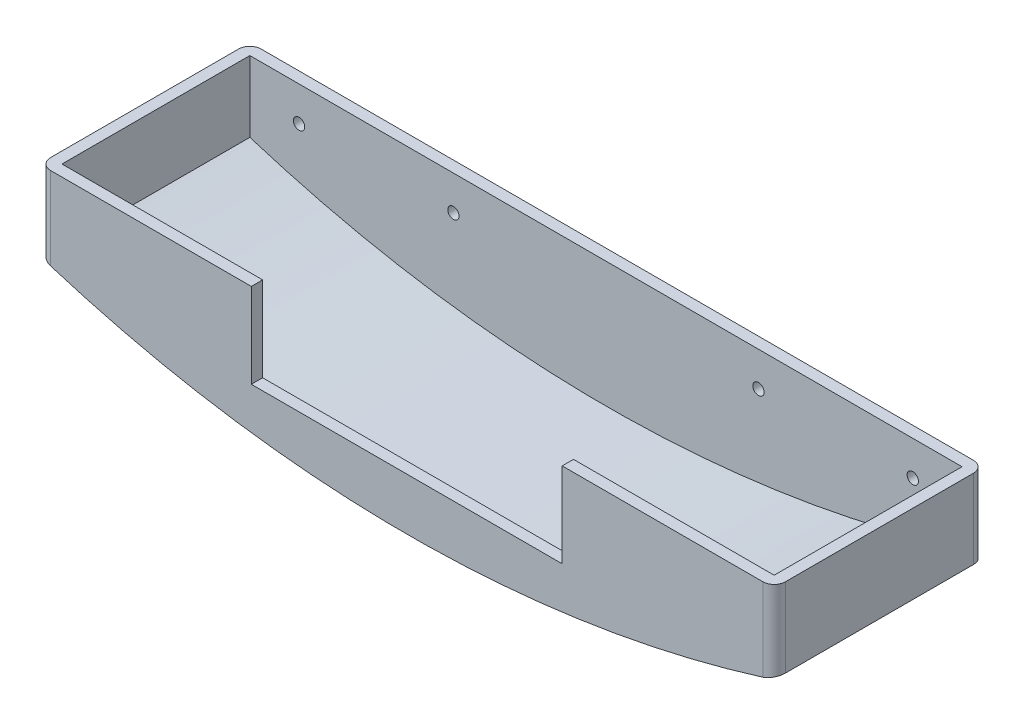
ISO-10303-21;
HEADER;
FILE_DESCRIPTION(('STEP AP214'),'2;1');
FILE_NAME('part.step','',(''),(''),'','','');
FILE_SCHEMA(('AUTOMOTIVE_DESIGN { 1 0 10303 214 1 1 1 1 }'));
ENDSEC;
DATA;
#1=APPLICATION_CONTEXT('core data for automotive mechanical design processes');
#2=APPLICATION_PROTOCOL_DEFINITION('international standard','automotive_design',2000,#1);
#3=PRODUCT_CONTEXT('',#1,'mechanical');
#4=PRODUCT('Part','Part','',(#3));
#5=PRODUCT_RELATED_PRODUCT_CATEGORY('part','',(#4));
#6=PRODUCT_DEFINITION_FORMATION('','',#4);
#7=PRODUCT_DEFINITION_CONTEXT('part definition',#1,'design');
#8=PRODUCT_DEFINITION('design','',#6,#7);
#9=PRODUCT_DEFINITION_SHAPE('','',#8);
#10=(LENGTH_UNIT() NAMED_UNIT(*) SI_UNIT(.MILLI.,.METRE.));
#11=(NAMED_UNIT(*) PLANE_ANGLE_UNIT() SI_UNIT($,.RADIAN.));
#12=(NAMED_UNIT(*) SI_UNIT($,.STERADIAN.) SOLID_ANGLE_UNIT());
#13=UNCERTAINTY_MEASURE_WITH_UNIT(LENGTH_MEASURE(1.E-05),#10,'distance_accuracy_value','');
#14=(GEOMETRIC_REPRESENTATION_CONTEXT(3) GLOBAL_UNCERTAINTY_ASSIGNED_CONTEXT((#13)) GLOBAL_UNIT_ASSIGNED_CONTEXT((#10,
#11,#12)) REPRESENTATION_CONTEXT('',''));
#15=CARTESIAN_POINT('',(0.,0.,0.));
#16=DIRECTION('',(0.,0.,1.));
#17=DIRECTION('',(1.,0.,0.));
#18=AXIS2_PLACEMENT_3D('',#15,#16,#17);
#19=CARTESIAN_POINT('',(65.,0.,-37.24));
#20=DIRECTION('',(0.,1.,0.));
#21=DIRECTION('',(-1.,0.,0.));
#22=AXIS2_PLACEMENT_3D('',#19,#20,#21);
#23=PLANE('',#22);
#24=DIRECTION('',(-1.,0.,0.));
#25=VECTOR('',#24,1.);
#26=CARTESIAN_POINT('',(65.,0.,-37.24));
#27=LINE('',#26,#25);
#28=CARTESIAN_POINT('',(63.,0.,-37.24));
#29=VERTEX_POINT('',#28);
#30=CARTESIAN_POINT('',(-63.,0.,-37.24));
#31=VERTEX_POINT('',#30);
#32=EDGE_CURVE('E194',#29,#31,#27,.T.);
#33=ORIENTED_EDGE('',*,*,#32,.T.);
#34=CARTESIAN_POINT('',(-63.,0.,-35.24));
#35=DIRECTION('',(0.,1.,0.));
#36=DIRECTION('',(-1.,0.,0.));
#37=AXIS2_PLACEMENT_3D('',#34,#35,#36);
#38=CIRCLE('',#37,2.);
#39=CARTESIAN_POINT('',(-65.,0.,-35.24));
#40=VERTEX_POINT('',#39);
#41=EDGE_CURVE('E383',#31,#40,#38,.T.);
#42=ORIENTED_EDGE('',*,*,#41,.T.);
#43=DIRECTION('',(0.,0.,1.));
#44=VECTOR('',#43,1.);
#45=CARTESIAN_POINT('',(-65.,0.,-37.24));
#46=LINE('',#45,#44);
#47=CARTESIAN_POINT('',(-65.,0.,-2.));
#48=VERTEX_POINT('',#47);
#49=EDGE_CURVE('E184',#40,#48,#46,.T.);
#50=ORIENTED_EDGE('',*,*,#49,.T.);
#51=CARTESIAN_POINT('',(-63.,0.,-2.));
#52=DIRECTION('',(0.,1.,0.));
#53=DIRECTION('',(-1.,0.,0.));
#54=AXIS2_PLACEMENT_3D('',#51,#52,#53);
#55=CIRCLE('',#54,2.);
#56=CARTESIAN_POINT('',(-63.,0.,0.));
#57=VERTEX_POINT('',#56);
#58=EDGE_CURVE('E53',#48,#57,#55,.T.);
#59=ORIENTED_EDGE('',*,*,#58,.T.);
#60=DIRECTION('',(-1.,0.,0.));
#61=VECTOR('',#60,1.);
#62=CARTESIAN_POINT('',(65.,0.,0.));
#63=LINE('',#62,#61);
#64=CARTESIAN_POINT('',(-27.5,0.,0.));
#65=VERTEX_POINT('',#64);
#66=EDGE_CURVE('E167',#65,#57,#63,.T.);
#67=ORIENTED_EDGE('',*,*,#66,.F.);
#68=DIRECTION('',(0.,0.,1.));
#69=VECTOR('',#68,1.);
#70=CARTESIAN_POINT('',(-27.5,0.,-10.));
#71=LINE('',#70,#69);
#72=CARTESIAN_POINT('',(-27.5,0.,-2.));
#73=VERTEX_POINT('',#72);
#74=EDGE_CURVE('E153',#73,#65,#71,.T.);
#75=ORIENTED_EDGE('',*,*,#74,.F.);
#76=DIRECTION('',(-1.,0.,0.));
#77=VECTOR('',#76,1.);
#78=CARTESIAN_POINT('',(65.,0.,-2.));
#79=LINE('',#78,#77);
#80=CARTESIAN_POINT('',(-63.,0.,-2.));
#81=VERTEX_POINT('',#80);
#82=EDGE_CURVE('E360',#73,#81,#79,.T.);
#83=ORIENTED_EDGE('',*,*,#82,.T.);
#84=DIRECTION('',(0.,0.,1.));
#85=VECTOR('',#84,1.);
#86=CARTESIAN_POINT('',(-63.,0.,-37.24));
#87=LINE('',#86,#85);
#88=CARTESIAN_POINT('',(-63.,0.,-35.24));
#89=VERTEX_POINT('',#88);
#90=EDGE_CURVE('E180',#89,#81,#87,.T.);
#91=ORIENTED_EDGE('',*,*,#90,.F.);
#92=DIRECTION('',(-1.,0.,0.));
#93=VECTOR('',#92,1.);
#94=CARTESIAN_POINT('',(65.,0.,-35.24));
#95=LINE('',#94,#93);
#96=CARTESIAN_POINT('',(63.,0.,-35.24));
#97=VERTEX_POINT('',#96);
#98=EDGE_CURVE('E352',#97,#89,#95,.T.);
#99=ORIENTED_EDGE('',*,*,#98,.F.);
#100=DIRECTION('',(0.,0.,1.));
#101=VECTOR('',#100,1.);
#102=CARTESIAN_POINT('',(63.,0.,-37.24));
#103=LINE('',#102,#101);
#104=CARTESIAN_POINT('',(63.,0.,-2.));
#105=VERTEX_POINT('',#104);
#106=EDGE_CURVE('E373',#97,#105,#103,.T.);
#107=ORIENTED_EDGE('',*,*,#106,.T.);
#108=CARTESIAN_POINT('',(27.5,0.,-2.));
#109=VERTEX_POINT('',#108);
#110=EDGE_CURVE('E355',#105,#109,#79,.T.);
#111=ORIENTED_EDGE('',*,*,#110,.T.);
#112=DIRECTION('',(0.,0.,1.));
#113=VECTOR('',#112,1.);
#114=CARTESIAN_POINT('',(27.5,0.,-10.));
#115=LINE('',#114,#113);
#116=CARTESIAN_POINT('',(27.5,0.,0.));
#117=VERTEX_POINT('',#116);
#118=EDGE_CURVE('E409',#109,#117,#115,.T.);
#119=ORIENTED_EDGE('',*,*,#118,.T.);
#120=CARTESIAN_POINT('',(63.,0.,0.));
#121=VERTEX_POINT('',#120);
#122=EDGE_CURVE('E175',#121,#117,#63,.T.);
#123=ORIENTED_EDGE('',*,*,#122,.F.);
#124=CARTESIAN_POINT('',(63.,0.,-2.));
#125=DIRECTION('',(0.,1.,0.));
#126=DIRECTION('',(-1.,0.,0.));
#127=AXIS2_PLACEMENT_3D('',#124,#125,#126);
#128=CIRCLE('',#127,2.);
#129=CARTESIAN_POINT('',(65.,0.,-2.));
#130=VERTEX_POINT('',#129);
#131=EDGE_CURVE('E60',#121,#130,#128,.T.);
#132=ORIENTED_EDGE('',*,*,#131,.T.);
#133=DIRECTION('',(0.,0.,1.));
#134=VECTOR('',#133,1.);
#135=CARTESIAN_POINT('',(65.,0.,-37.24));
#136=LINE('',#135,#134);
#137=CARTESIAN_POINT('',(65.,0.,-35.24));
#138=VERTEX_POINT('',#137);
#139=EDGE_CURVE('E186',#138,#130,#136,.T.);
#140=ORIENTED_EDGE('',*,*,#139,.F.);
#141=CARTESIAN_POINT('',(63.,0.,-35.24));
#142=DIRECTION('',(0.,1.,0.));
#143=DIRECTION('',(-1.,0.,0.));
#144=AXIS2_PLACEMENT_3D('',#141,#142,#143);
#145=CIRCLE('',#144,2.);
#146=EDGE_CURVE('E385',#138,#29,#145,.T.);
#147=ORIENTED_EDGE('',*,*,#146,.T.);
#148=EDGE_LOOP('',(#33,#42,#50,#59,#67,#75,#83,#91,#99,#107,#111,#119,#123,#132,#140,#147));
#149=FACE_BOUND('',#148,.T.);
#150=ADVANCED_FACE('F37',(#149),#23,.T.);
#151=CARTESIAN_POINT('',(-65.,0.,-37.24));
#152=DIRECTION('',(-1.,0.,0.));
#153=DIRECTION('',(0.,0.,1.));
#154=AXIS2_PLACEMENT_3D('',#151,#152,#153);
#155=PLANE('',#154);
#156=ORIENTED_EDGE('',*,*,#49,.F.);
#157=DIRECTION('',(0.,-1.,0.));
#158=VECTOR('',#157,1.);
#159=CARTESIAN_POINT('',(-65.,0.,-35.24));
#160=LINE('',#159,#158);
#161=CARTESIAN_POINT('',(-65.0000000000001,-14.,-35.24));
#162=VERTEX_POINT('',#161);
#163=EDGE_CURVE('E215',#40,#162,#160,.T.);
#164=ORIENTED_EDGE('',*,*,#163,.T.);
#165=DIRECTION('',(0.,0.,1.));
#166=VECTOR('',#165,1.);
#167=CARTESIAN_POINT('',(-65.0000000000001,-14.,-37.24));
#168=LINE('',#167,#166);
#169=CARTESIAN_POINT('',(-65.0000000000001,-14.,-2.));
#170=VERTEX_POINT('',#169);
#171=EDGE_CURVE('E191',#162,#170,#168,.T.);
#172=ORIENTED_EDGE('',*,*,#171,.T.);
#173=DIRECTION('',(0.,-1.,0.));
#174=VECTOR('',#173,1.);
#175=CARTESIAN_POINT('',(-65.,0.,-2.));
#176=LINE('',#175,#174);
#177=EDGE_CURVE('E201',#170,#48,#176,.F.);
#178=ORIENTED_EDGE('',*,*,#177,.T.);
#179=EDGE_LOOP('',(#156,#164,#172,#178));
#180=FACE_BOUND('',#179,.T.);
#181=ADVANCED_FACE('F240',(#180),#155,.T.);
#182=CARTESIAN_POINT('',(65.,0.,-37.24));
#183=DIRECTION('',(1.,0.,0.));
#184=DIRECTION('',(0.,0.,-1.));
#185=AXIS2_PLACEMENT_3D('',#182,#183,#184);
#186=PLANE('',#185);
#187=DIRECTION('',(0.,0.,1.));
#188=VECTOR('',#187,1.);
#189=CARTESIAN_POINT('',(65.,-14.,-37.24));
#190=LINE('',#189,#188);
#191=CARTESIAN_POINT('',(65.,-14.,-35.24));
#192=VERTEX_POINT('',#191);
#193=CARTESIAN_POINT('',(65.,-14.,-2.));
#194=VERTEX_POINT('',#193);
#195=EDGE_CURVE('E188',#192,#194,#190,.T.);
#196=ORIENTED_EDGE('',*,*,#195,.F.);
#197=DIRECTION('',(0.,1.,0.));
#198=VECTOR('',#197,1.);
#199=CARTESIAN_POINT('',(65.,0.,-35.24));
#200=LINE('',#199,#198);
#201=EDGE_CURVE('E11',#192,#138,#200,.T.);
#202=ORIENTED_EDGE('',*,*,#201,.T.);
#203=ORIENTED_EDGE('',*,*,#139,.T.);
#204=DIRECTION('',(0.,1.,0.));
#205=VECTOR('',#204,1.);
#206=CARTESIAN_POINT('',(65.,-14.,-2.));
#207=LINE('',#206,#205);
#208=EDGE_CURVE('E46',#130,#194,#207,.F.);
#209=ORIENTED_EDGE('',*,*,#208,.T.);
#210=EDGE_LOOP('',(#196,#202,#203,#209));
#211=FACE_BOUND('',#210,.T.);
#212=ADVANCED_FACE('F237',(#211),#186,.T.);
#213=CARTESIAN_POINT('',(0.,187.789494275594,-37.24));
#214=DIRECTION('',(0.,0.,1.));
#215=DIRECTION('',(1.,0.,0.));
#216=AXIS2_PLACEMENT_3D('',#213,#214,#215);
#217=CYLINDRICAL_SURFACE('',#216,212.);
#218=ORIENTED_EDGE('',*,*,#171,.F.);
#219=CARTESIAN_POINT('',(-65.,-14.,-35.24));
#220=CARTESIAN_POINT('',(-65.0000010076891,-13.9999995445541,-35.2943286379213));
#221=CARTESIAN_POINT('',(-64.9977848014529,-14.0007135690222,-35.3486305020664));
#222=CARTESIAN_POINT('',(-64.9889526561711,-14.0035582922236,-35.4568298541154));
#223=CARTESIAN_POINT('',(-64.982337369415,-14.0056887809257,-35.510727400773));
#224=CARTESIAN_POINT('',(-64.9559963711433,-14.0141699534661,-35.6709925896998));
#225=CARTESIAN_POINT('',(-64.9297750404595,-14.0226105111465,-35.7762606881523));
#226=CARTESIAN_POINT('',(-64.8609434383336,-14.0447429212871,-35.9806314037387));
#227=CARTESIAN_POINT('',(-64.8183332536333,-14.0584347459538,-36.0797340535014));
#228=CARTESIAN_POINT('',(-64.7181735441311,-14.090571034354,-36.2692548894506));
#229=CARTESIAN_POINT('',(-64.6606208521596,-14.1090165056504,-36.3596712289396));
#230=CARTESIAN_POINT('',(-64.5310756859547,-14.1504596130845,-36.5313613762757));
#231=CARTESIAN_POINT('',(-64.4588080628662,-14.1735438600475,-36.6124062219706));
#232=CARTESIAN_POINT('',(-64.3028041674245,-14.2232678737019,-36.7612934673602));
#233=CARTESIAN_POINT('',(-64.2190649418631,-14.249908555904,-36.8291324564635));
#234=CARTESIAN_POINT('',(-64.0384334663236,-14.3072360442034,-36.9529463926834));
#235=CARTESIAN_POINT('',(-63.9411160075387,-14.3380518275259,-37.0082407321939));
#236=CARTESIAN_POINT('',(-63.7392205454348,-14.4018086225927,-37.1016999104025));
#237=CARTESIAN_POINT('',(-63.6346422976539,-14.4347497058907,-37.139864172028));
#238=CARTESIAN_POINT('',(-63.4417590057534,-14.4953329787881,-37.1926440222343));
#239=CARTESIAN_POINT('',(-63.3542281575028,-14.522764833063,-37.2103900065337));
#240=CARTESIAN_POINT('',(-63.1778107788306,-14.5779262665079,-37.2340689145037));
#241=CARTESIAN_POINT('',(-63.0889263030721,-14.605655378571,-37.2400182324757));
#242=CARTESIAN_POINT('',(-63.,-14.6333305243776,-37.24));
#243=B_SPLINE_CURVE_WITH_KNOTS('',3,(#219,#220,#221,#222,#223,#224,#225,#226,#227,#228,#229,
#230,#231,#232,#233,#234,#235,#236,#237,#238,#239,#240,#241,#242),.UNSPECIFIED.,.F.,.F.,(4,2,2,
2,2,2,2,2,2,2,2,4),(0.,0.162883261341779,0.325742375968807,0.65048971243152,0.975235330116859,
1.30004983619467,1.63161242177545,1.96326052460979,2.31000505152278,2.656761258578,
2.93631401327267,3.21547798920995),.UNSPECIFIED.);
#244=CARTESIAN_POINT('',(-63.,-14.6333305243776,-37.24));
#245=VERTEX_POINT('',#244);
#246=EDGE_CURVE('E252',#162,#245,#243,.T.);
#247=ORIENTED_EDGE('',*,*,#246,.T.);
#248=CARTESIAN_POINT('',(0.,187.789494275594,-37.24));
#249=DIRECTION('',(0.,0.,1.));
#250=DIRECTION('',(-1.,0.,0.));
#251=AXIS2_PLACEMENT_3D('',#248,#249,#250);
#252=CIRCLE('',#251,212.);
#253=CARTESIAN_POINT('',(63.,-14.6333305243776,-37.24));
#254=VERTEX_POINT('',#253);
#255=EDGE_CURVE('E178',#245,#254,#252,.T.);
#256=ORIENTED_EDGE('',*,*,#255,.T.);
#257=CARTESIAN_POINT('',(63.,-14.6333305243776,-37.24));
#258=CARTESIAN_POINT('',(63.0583876368944,-14.6151587061581,-37.239998077745));
#259=CARTESIAN_POINT('',(63.116739619718,-14.5969699395246,-37.2374417148744));
#260=CARTESIAN_POINT('',(63.2330225697715,-14.5606689531832,-37.2272372447312));
#261=CARTESIAN_POINT('',(63.2909535230831,-14.5425567360141,-37.2195889698994));
#262=CARTESIAN_POINT('',(63.4635501307786,-14.4885131371312,-37.1890383149502));
#263=CARTESIAN_POINT('',(63.5770547910269,-14.452863832836,-37.1585300817769));
#264=CARTESIAN_POINT('',(63.7975311172156,-14.383422877408,-37.0778662793402));
#265=CARTESIAN_POINT('',(63.9044969043234,-14.349632900568,-37.0276933221242));
#266=CARTESIAN_POINT('',(64.1085580112034,-14.2850074268952,-36.9088381655158));
#267=CARTESIAN_POINT('',(64.2056586468613,-14.2541703394038,-36.8401660081428));
#268=CARTESIAN_POINT('',(64.3848475484849,-14.1971391313755,-36.6876666981513));
#269=CARTESIAN_POINT('',(64.4672172588401,-14.1708583509968,-36.604203100609));
#270=CARTESIAN_POINT('',(64.6166520233958,-14.1230968451389,-36.4232957215495));
#271=CARTESIAN_POINT('',(64.683716343878,-14.1016163497796,-36.3258512701748));
#272=CARTESIAN_POINT('',(64.7972981229584,-14.0651899984829,-36.1245716333793));
#273=CARTESIAN_POINT('',(64.8446155008396,-14.0499900571488,-36.0212330683994));
#274=CARTESIAN_POINT('',(64.9211503965908,-14.0253859182502,-35.8074727183703));
#275=CARTESIAN_POINT('',(64.9503917989189,-14.0159740727448,-35.6970604939599));
#276=CARTESIAN_POINT('',(64.9800021092632,-14.0064408251966,-35.5280022232558));
#277=CARTESIAN_POINT('',(64.9874980370408,-14.004026781358,-35.4706435026634));
#278=CARTESIAN_POINT('',(64.9974940161008,-14.0008072386369,-35.3555332595534));
#279=CARTESIAN_POINT('',(65.0000014365102,-13.9999993670844,-35.2977824430768));
#280=CARTESIAN_POINT('',(65.,-14.,-35.24));
#281=B_SPLINE_CURVE_WITH_KNOTS('',3,(#257,#258,#259,#260,#261,#262,#263,#264,#265,#266,#267,
#268,#269,#270,#271,#272,#273,#274,#275,#276,#277,#278,#279,#280),.UNSPECIFIED.,.F.,.F.,(4,2,2,
2,2,2,2,2,2,2,2,4),(0.,0.183338948530308,0.366683930477798,0.73326450010086,1.10016994171588,
1.46687661404831,1.82557816277136,2.1842969035203,2.52659753607378,2.86844490184915,
3.04192648188194,3.21515160046188),.UNSPECIFIED.);
#282=EDGE_CURVE('E225',#254,#192,#281,.T.);
#283=ORIENTED_EDGE('',*,*,#282,.T.);
#284=ORIENTED_EDGE('',*,*,#195,.T.);
#285=CARTESIAN_POINT('',(65.,-14.,-2.));
#286=CARTESIAN_POINT('',(65.0000010076891,-13.9999995445541,-1.94567136207872));
#287=CARTESIAN_POINT('',(64.9977848014529,-14.0007135690221,-1.89136949793362));
#288=CARTESIAN_POINT('',(64.9889526561711,-14.0035582922235,-1.78317014588455));
#289=CARTESIAN_POINT('',(64.982337369415,-14.0056887809256,-1.72927259922698));
#290=CARTESIAN_POINT('',(64.9559963711433,-14.0141699534661,-1.56900741030021));
#291=CARTESIAN_POINT('',(64.9297750404595,-14.0226105111465,-1.46373931184768));
#292=CARTESIAN_POINT('',(64.8609434383336,-14.0447429212871,-1.25936859626131));
#293=CARTESIAN_POINT('',(64.8183332536333,-14.0584347459538,-1.1602659464986));
#294=CARTESIAN_POINT('',(64.7181735441311,-14.090571034354,-0.970745110549362));
#295=CARTESIAN_POINT('',(64.6606208521596,-14.1090165056503,-0.880328771060424));
#296=CARTESIAN_POINT('',(64.5310756859547,-14.1504596130844,-0.708638623724269));
#297=CARTESIAN_POINT('',(64.4588080628662,-14.1735438600475,-0.627593778029421));
#298=CARTESIAN_POINT('',(64.3028041674245,-14.2232678737019,-0.478706532639801));
#299=CARTESIAN_POINT('',(64.2190649418631,-14.2499085559039,-0.410867543536451));
#300=CARTESIAN_POINT('',(64.0384334663236,-14.3072360442033,-0.287053607316557));
#301=CARTESIAN_POINT('',(63.9411160075387,-14.3380518275259,-0.231759267806097));
#302=CARTESIAN_POINT('',(63.7392205454348,-14.4018086225927,-0.138300089597506));
#303=CARTESIAN_POINT('',(63.6346422976538,-14.4347497058906,-0.100135827971964));
#304=CARTESIAN_POINT('',(63.4417590057534,-14.495332978788,-0.0473559777657152));
#305=CARTESIAN_POINT('',(63.3542281575028,-14.522764833063,-0.0296099934663369));
#306=CARTESIAN_POINT('',(63.1778107788306,-14.5779262665079,-0.00593108549632685));
#307=CARTESIAN_POINT('',(63.0889263030721,-14.605655378571,1.82324756847469E-05));
#308=CARTESIAN_POINT('',(63.,-14.6333305243776,0.));
#309=B_SPLINE_CURVE_WITH_KNOTS('',3,(#285,#286,#287,#288,#289,#290,#291,#292,#293,#294,#295,
#296,#297,#298,#299,#300,#301,#302,#303,#304,#305,#306,#307,#308),.UNSPECIFIED.,.F.,.F.,(4,2,2,
2,2,2,2,2,2,2,2,4),(0.,0.162883261341782,0.325742375968809,0.650489712431526,0.975235330116869,
1.30004983619468,1.63161242177545,1.96326052460978,2.31000505152277,2.656761258578,
2.93631401327267,3.21547798920995),.UNSPECIFIED.);
#310=CARTESIAN_POINT('',(63.,-14.6333305243776,0.));
#311=VERTEX_POINT('',#310);
#312=EDGE_CURVE('E218',#194,#311,#309,.T.);
#313=ORIENTED_EDGE('',*,*,#312,.T.);
#314=CARTESIAN_POINT('',(0.,187.789494275594,0.));
#315=DIRECTION('',(0.,0.,1.));
#316=DIRECTION('',(-1.,0.,0.));
#317=AXIS2_PLACEMENT_3D('',#314,#315,#316);
#318=CIRCLE('',#317,212.);
#319=CARTESIAN_POINT('',(-63.,-14.6333305243776,0.));
#320=VERTEX_POINT('',#319);
#321=EDGE_CURVE('E176',#320,#311,#318,.T.);
#322=ORIENTED_EDGE('',*,*,#321,.F.);
#323=CARTESIAN_POINT('',(-63.,-14.6333305243776,0.));
#324=CARTESIAN_POINT('',(-63.0583876368944,-14.6151587061581,-1.92225501459273E-06));
#325=CARTESIAN_POINT('',(-63.116739619718,-14.5969699395246,-0.00255828512556235));
#326=CARTESIAN_POINT('',(-63.2330225697715,-14.5606689531833,-0.0127627552687821));
#327=CARTESIAN_POINT('',(-63.2909535230831,-14.5425567360142,-0.0204110301005626));
#328=CARTESIAN_POINT('',(-63.4635501307787,-14.4885131371312,-0.0509616850497913));
#329=CARTESIAN_POINT('',(-63.5770547910269,-14.452863832836,-0.0814699182231165));
#330=CARTESIAN_POINT('',(-63.7975311172157,-14.383422877408,-0.162133720659755));
#331=CARTESIAN_POINT('',(-63.9044969043234,-14.349632900568,-0.212306677875807));
#332=CARTESIAN_POINT('',(-64.1085580112034,-14.2850074268952,-0.331161834484164));
#333=CARTESIAN_POINT('',(-64.2056586468613,-14.2541703394038,-0.399833991857162));
#334=CARTESIAN_POINT('',(-64.3848475484849,-14.1971391313756,-0.552333301848655));
#335=CARTESIAN_POINT('',(-64.4672172588401,-14.1708583509968,-0.63579689939102));
#336=CARTESIAN_POINT('',(-64.6166520233958,-14.1230968451389,-0.81670427845054));
#337=CARTESIAN_POINT('',(-64.683716343878,-14.1016163497796,-0.914148729825164));
#338=CARTESIAN_POINT('',(-64.7972981229584,-14.0651899984828,-1.1154283666207));
#339=CARTESIAN_POINT('',(-64.8446155008396,-14.0499900571488,-1.2187669316006));
#340=CARTESIAN_POINT('',(-64.9211503965909,-14.0253859182503,-1.43252728162972));
#341=CARTESIAN_POINT('',(-64.9503917989189,-14.0159740727448,-1.54293950604008));
#342=CARTESIAN_POINT('',(-64.9800021092632,-14.0064408251966,-1.71199777674418));
#343=CARTESIAN_POINT('',(-64.9874980370408,-14.004026781358,-1.7693564973366));
#344=CARTESIAN_POINT('',(-64.9974940161008,-14.0008072386369,-1.88446674044657));
#345=CARTESIAN_POINT('',(-65.0000014365102,-13.9999993670844,-1.94221755692317));
#346=CARTESIAN_POINT('',(-65.,-14.0000000000001,-2.));
#347=B_SPLINE_CURVE_WITH_KNOTS('',3,(#323,#324,#325,#326,#327,#328,#329,#330,#331,#332,#333,
#334,#335,#336,#337,#338,#339,#340,#341,#342,#343,#344,#345,#346),.UNSPECIFIED.,.F.,.F.,(4,2,2,
2,2,2,2,2,2,2,2,4),(0.,0.183338948530284,0.366683930477784,0.733264500100867,1.10016994171587,
1.46687661404831,1.82557816277136,2.18429690352031,2.52659753607379,2.86844490184917,
3.04192648188194,3.21515160046187),.UNSPECIFIED.);
#348=EDGE_CURVE('E246',#320,#170,#347,.T.);
#349=ORIENTED_EDGE('',*,*,#348,.T.);
#350=EDGE_LOOP('',(#218,#247,#256,#283,#284,#313,#322,#349));
#351=FACE_BOUND('',#350,.T.);
#352=ADVANCED_FACE('F231',(#351),#217,.T.);
#353=CARTESIAN_POINT('',(0.,187.789494275594,-37.24));
#354=DIRECTION('',(0.,0.,-1.));
#355=DIRECTION('',(-1.,0.,0.));
#356=AXIS2_PLACEMENT_3D('',#353,#354,#355);
#357=PLANE('',#356);
#358=CARTESIAN_POINT('',(54.2856260739427,-6.10000000000126,-37.24));
#359=DIRECTION('',(0.,0.,-1.));
#360=DIRECTION('',(-1.,0.,0.));
#361=AXIS2_PLACEMENT_3D('',#358,#359,#360);
#362=CIRCLE('',#361,0.999999999999998);
#363=CARTESIAN_POINT('',(53.2856260739427,-6.10000000000126,-37.24));
#364=VERTEX_POINT('',#363);
#365=EDGE_CURVE('E206',#364,#364,#362,.T.);
#366=ORIENTED_EDGE('',*,*,#365,.F.);
#367=EDGE_LOOP('',(#366));
#368=FACE_BOUND('',#367,.T.);
#369=CARTESIAN_POINT('',(-26.9856260739412,-6.1000000000013,-37.24));
#370=DIRECTION('',(0.,0.,-1.));
#371=DIRECTION('',(-1.,0.,0.));
#372=AXIS2_PLACEMENT_3D('',#369,#370,#371);
#373=CIRCLE('',#372,0.999999999998762);
#374=CARTESIAN_POINT('',(-27.98562607394,-6.1000000000013,-37.24));
#375=VERTEX_POINT('',#374);
#376=EDGE_CURVE('E430',#375,#375,#373,.T.);
#377=ORIENTED_EDGE('',*,*,#376,.F.);
#378=EDGE_LOOP('',(#377));
#379=FACE_BOUND('',#378,.T.);
#380=CARTESIAN_POINT('',(-54.2856260739412,-6.1000000000013,-37.24));
#381=DIRECTION('',(0.,0.,-1.));
#382=DIRECTION('',(-1.,0.,0.));
#383=AXIS2_PLACEMENT_3D('',#380,#381,#382);
#384=CIRCLE('',#383,0.999999999998762);
#385=CARTESIAN_POINT('',(-55.28562607394,-6.1000000000013,-37.24));
#386=VERTEX_POINT('',#385);
#387=EDGE_CURVE('E426',#386,#386,#384,.T.);
#388=ORIENTED_EDGE('',*,*,#387,.F.);
#389=EDGE_LOOP('',(#388));
#390=FACE_BOUND('',#389,.T.);
#391=CARTESIAN_POINT('',(26.9856260739427,-6.10000000000126,-37.24));
#392=DIRECTION('',(0.,0.,-1.));
#393=DIRECTION('',(-1.,0.,0.));
#394=AXIS2_PLACEMENT_3D('',#391,#392,#393);
#395=CIRCLE('',#394,1.);
#396=CARTESIAN_POINT('',(25.9856260739427,-6.10000000000126,-37.24));
#397=VERTEX_POINT('',#396);
#398=EDGE_CURVE('E429',#397,#397,#395,.T.);
#399=ORIENTED_EDGE('',*,*,#398,.F.);
#400=EDGE_LOOP('',(#399));
#401=FACE_BOUND('',#400,.T.);
#402=ORIENTED_EDGE('',*,*,#255,.F.);
#403=DIRECTION('',(0.,-1.,0.));
#404=VECTOR('',#403,1.);
#405=CARTESIAN_POINT('',(-63.,187.789494275594,-37.24));
#406=LINE('',#405,#404);
#407=EDGE_CURVE('E390',#245,#31,#406,.F.);
#408=ORIENTED_EDGE('',*,*,#407,.T.);
#409=ORIENTED_EDGE('',*,*,#32,.F.);
#410=DIRECTION('',(0.,1.,0.));
#411=VECTOR('',#410,1.);
#412=CARTESIAN_POINT('',(63.,187.789494275594,-37.24));
#413=LINE('',#412,#411);
#414=EDGE_CURVE('E443',#29,#254,#413,.F.);
#415=ORIENTED_EDGE('',*,*,#414,.T.);
#416=EDGE_LOOP('',(#402,#408,#409,#415));
#417=FACE_BOUND('',#416,.T.);
#418=ADVANCED_FACE('F236',(#368,#379,#390,#401,#417),#357,.T.);
#419=CARTESIAN_POINT('',(0.,187.789494275594,0.));
#420=DIRECTION('',(0.,0.,-1.));
#421=DIRECTION('',(-1.,0.,0.));
#422=AXIS2_PLACEMENT_3D('',#419,#420,#421);
#423=PLANE('',#422);
#424=ORIENTED_EDGE('',*,*,#66,.T.);
#425=DIRECTION('',(0.,-1.,0.));
#426=VECTOR('',#425,1.);
#427=CARTESIAN_POINT('',(-63.,-14.,0.));
#428=LINE('',#427,#426);
#429=EDGE_CURVE('E394',#57,#320,#428,.T.);
#430=ORIENTED_EDGE('',*,*,#429,.T.);
#431=ORIENTED_EDGE('',*,*,#321,.T.);
#432=DIRECTION('',(0.,1.,0.));
#433=VECTOR('',#432,1.);
#434=CARTESIAN_POINT('',(63.,0.,0.));
#435=LINE('',#434,#433);
#436=EDGE_CURVE('E391',#311,#121,#435,.T.);
#437=ORIENTED_EDGE('',*,*,#436,.T.);
#438=ORIENTED_EDGE('',*,*,#122,.T.);
#439=DIRECTION('',(0.,1.,0.));
#440=VECTOR('',#439,1.);
#441=CARTESIAN_POINT('',(27.5,-15.,0.));
#442=LINE('',#441,#440);
#443=CARTESIAN_POINT('',(27.5,-15.,0.));
#444=VERTEX_POINT('',#443);
#445=EDGE_CURVE('E162',#444,#117,#442,.T.);
#446=ORIENTED_EDGE('',*,*,#445,.F.);
#447=DIRECTION('',(1.,0.,0.));
#448=VECTOR('',#447,1.);
#449=CARTESIAN_POINT('',(-27.5,-15.,0.));
#450=LINE('',#449,#448);
#451=CARTESIAN_POINT('',(-27.5,-15.,0.));
#452=VERTEX_POINT('',#451);
#453=EDGE_CURVE('E171',#452,#444,#450,.T.);
#454=ORIENTED_EDGE('',*,*,#453,.F.);
#455=DIRECTION('',(0.,-1.,0.));
#456=VECTOR('',#455,1.);
#457=CARTESIAN_POINT('',(-27.5,0.,0.));
#458=LINE('',#457,#456);
#459=EDGE_CURVE('E156',#65,#452,#458,.T.);
#460=ORIENTED_EDGE('',*,*,#459,.F.);
#461=EDGE_LOOP('',(#424,#430,#431,#437,#438,#446,#454,#460));
#462=FACE_BOUND('',#461,.T.);
#463=ADVANCED_FACE('F165',(#462),#423,.F.);
#464=CARTESIAN_POINT('',(-63.,0.,-37.24));
#465=DIRECTION('',(-1.,0.,0.));
#466=DIRECTION('',(0.,0.,1.));
#467=AXIS2_PLACEMENT_3D('',#464,#465,#466);
#468=PLANE('',#467);
#469=DIRECTION('',(0.,-1.,0.));
#470=VECTOR('',#469,1.);
#471=CARTESIAN_POINT('',(-63.,0.,-2.));
#472=LINE('',#471,#470);
#473=CARTESIAN_POINT('',(-63.,-12.5377380219646,-2.));
#474=VERTEX_POINT('',#473);
#475=EDGE_CURVE('E364',#81,#474,#472,.T.);
#476=ORIENTED_EDGE('',*,*,#475,.T.);
#477=DIRECTION('',(0.,0.,1.));
#478=VECTOR('',#477,1.);
#479=CARTESIAN_POINT('',(-63.,-12.5377380219646,-35.24));
#480=LINE('',#479,#478);
#481=CARTESIAN_POINT('',(-63.,-12.5377380219646,-35.24));
#482=VERTEX_POINT('',#481);
#483=EDGE_CURVE('E365',#482,#474,#480,.T.);
#484=ORIENTED_EDGE('',*,*,#483,.F.);
#485=DIRECTION('',(0.,-1.,0.));
#486=VECTOR('',#485,1.);
#487=CARTESIAN_POINT('',(-63.,0.,-35.24));
#488=LINE('',#487,#486);
#489=EDGE_CURVE('E347',#89,#482,#488,.T.);
#490=ORIENTED_EDGE('',*,*,#489,.F.);
#491=ORIENTED_EDGE('',*,*,#90,.T.);
#492=EDGE_LOOP('',(#476,#484,#490,#491));
#493=FACE_BOUND('',#492,.T.);
#494=ADVANCED_FACE('F282',(#493),#468,.F.);
#495=CARTESIAN_POINT('',(63.,0.,-37.24));
#496=DIRECTION('',(1.,0.,0.));
#497=DIRECTION('',(0.,0.,-1.));
#498=AXIS2_PLACEMENT_3D('',#495,#496,#497);
#499=PLANE('',#498);
#500=DIRECTION('',(0.,1.,0.));
#501=VECTOR('',#500,1.);
#502=CARTESIAN_POINT('',(63.,0.,-2.));
#503=LINE('',#502,#501);
#504=CARTESIAN_POINT('',(63.,-12.5377380219646,-2.));
#505=VERTEX_POINT('',#504);
#506=EDGE_CURVE('E370',#505,#105,#503,.T.);
#507=ORIENTED_EDGE('',*,*,#506,.T.);
#508=ORIENTED_EDGE('',*,*,#106,.F.);
#509=DIRECTION('',(0.,1.,0.));
#510=VECTOR('',#509,1.);
#511=CARTESIAN_POINT('',(63.,0.,-35.24));
#512=LINE('',#511,#510);
#513=CARTESIAN_POINT('',(63.,-12.5377380219646,-35.24));
#514=VERTEX_POINT('',#513);
#515=EDGE_CURVE('E357',#514,#97,#512,.T.);
#516=ORIENTED_EDGE('',*,*,#515,.F.);
#517=DIRECTION('',(0.,0.,1.));
#518=VECTOR('',#517,1.);
#519=CARTESIAN_POINT('',(63.,-12.5377380219646,-35.24));
#520=LINE('',#519,#518);
#521=EDGE_CURVE('E367',#514,#505,#520,.T.);
#522=ORIENTED_EDGE('',*,*,#521,.T.);
#523=EDGE_LOOP('',(#507,#508,#516,#522));
#524=FACE_BOUND('',#523,.T.);
#525=ADVANCED_FACE('F298',(#524),#499,.F.);
#526=CARTESIAN_POINT('',(0.,187.789494275594,-37.24));
#527=DIRECTION('',(0.,0.,1.));
#528=DIRECTION('',(1.,0.,0.));
#529=AXIS2_PLACEMENT_3D('',#526,#527,#528);
#530=CYLINDRICAL_SURFACE('',#529,210.);
#531=CARTESIAN_POINT('',(0.,187.789494275594,-2.));
#532=DIRECTION('',(0.,0.,-1.));
#533=DIRECTION('',(-1.,0.,0.));
#534=AXIS2_PLACEMENT_3D('',#531,#532,#533);
#535=CIRCLE('',#534,210.);
#536=EDGE_CURVE('E368',#474,#505,#535,.F.);
#537=ORIENTED_EDGE('',*,*,#536,.T.);
#538=ORIENTED_EDGE('',*,*,#521,.F.);
#539=CARTESIAN_POINT('',(0.,187.789494275594,-35.24));
#540=DIRECTION('',(0.,0.,-1.));
#541=DIRECTION('',(-1.,0.,0.));
#542=AXIS2_PLACEMENT_3D('',#539,#540,#541);
#543=CIRCLE('',#542,210.);
#544=EDGE_CURVE('E350',#482,#514,#543,.F.);
#545=ORIENTED_EDGE('',*,*,#544,.F.);
#546=ORIENTED_EDGE('',*,*,#483,.T.);
#547=EDGE_LOOP('',(#537,#538,#545,#546));
#548=FACE_BOUND('',#547,.T.);
#549=ADVANCED_FACE('F294',(#548),#530,.F.);
#550=CARTESIAN_POINT('',(0.,187.789494275594,-35.24));
#551=DIRECTION('',(0.,0.,-1.));
#552=DIRECTION('',(-1.,0.,0.));
#553=AXIS2_PLACEMENT_3D('',#550,#551,#552);
#554=PLANE('',#553);
#555=CARTESIAN_POINT('',(54.2856260739427,-6.10000000000126,-35.24));
#556=DIRECTION('',(0.,0.,-1.));
#557=DIRECTION('',(-1.,0.,0.));
#558=AXIS2_PLACEMENT_3D('',#555,#556,#557);
#559=CIRCLE('',#558,0.999999999999998);
#560=CARTESIAN_POINT('',(53.2856260739427,-6.10000000000126,-35.24));
#561=VERTEX_POINT('',#560);
#562=EDGE_CURVE('E172',#561,#561,#559,.T.);
#563=ORIENTED_EDGE('',*,*,#562,.T.);
#564=EDGE_LOOP('',(#563));
#565=FACE_BOUND('',#564,.T.);
#566=CARTESIAN_POINT('',(-26.9856260739412,-6.1000000000013,-35.24));
#567=DIRECTION('',(0.,0.,-1.));
#568=DIRECTION('',(-1.,0.,0.));
#569=AXIS2_PLACEMENT_3D('',#566,#567,#568);
#570=CIRCLE('',#569,0.999999999998762);
#571=CARTESIAN_POINT('',(-27.98562607394,-6.1000000000013,-35.24));
#572=VERTEX_POINT('',#571);
#573=EDGE_CURVE('E209',#572,#572,#570,.T.);
#574=ORIENTED_EDGE('',*,*,#573,.T.);
#575=EDGE_LOOP('',(#574));
#576=FACE_BOUND('',#575,.T.);
#577=CARTESIAN_POINT('',(-54.2856260739412,-6.1000000000013,-35.24));
#578=DIRECTION('',(0.,0.,-1.));
#579=DIRECTION('',(-1.,0.,0.));
#580=AXIS2_PLACEMENT_3D('',#577,#578,#579);
#581=CIRCLE('',#580,0.999999999998762);
#582=CARTESIAN_POINT('',(-55.28562607394,-6.1000000000013,-35.24));
#583=VERTEX_POINT('',#582);
#584=EDGE_CURVE('E205',#583,#583,#581,.T.);
#585=ORIENTED_EDGE('',*,*,#584,.T.);
#586=EDGE_LOOP('',(#585));
#587=FACE_BOUND('',#586,.T.);
#588=CARTESIAN_POINT('',(26.9856260739427,-6.10000000000126,-35.24));
#589=DIRECTION('',(0.,0.,-1.));
#590=DIRECTION('',(-1.,0.,0.));
#591=AXIS2_PLACEMENT_3D('',#588,#589,#590);
#592=CIRCLE('',#591,1.);
#593=CARTESIAN_POINT('',(25.9856260739427,-6.10000000000126,-35.24));
#594=VERTEX_POINT('',#593);
#595=EDGE_CURVE('E202',#594,#594,#592,.T.);
#596=ORIENTED_EDGE('',*,*,#595,.T.);
#597=EDGE_LOOP('',(#596));
#598=FACE_BOUND('',#597,.T.);
#599=ORIENTED_EDGE('',*,*,#489,.T.);
#600=ORIENTED_EDGE('',*,*,#544,.T.);
#601=ORIENTED_EDGE('',*,*,#515,.T.);
#602=ORIENTED_EDGE('',*,*,#98,.T.);
#603=EDGE_LOOP('',(#599,#600,#601,#602));
#604=FACE_BOUND('',#603,.T.);
#605=ADVANCED_FACE('F290',(#565,#576,#587,#598,#604),#554,.F.);
#606=CARTESIAN_POINT('',(0.,187.789494275594,-2.));
#607=DIRECTION('',(0.,0.,-1.));
#608=DIRECTION('',(-1.,0.,0.));
#609=AXIS2_PLACEMENT_3D('',#606,#607,#608);
#610=PLANE('',#609);
#611=DIRECTION('',(0.,-1.,0.));
#612=VECTOR('',#611,1.);
#613=CARTESIAN_POINT('',(27.5,187.789494275594,-2.));
#614=LINE('',#613,#612);
#615=CARTESIAN_POINT('',(27.5,-15.,-2.));
#616=VERTEX_POINT('',#615);
#617=EDGE_CURVE('E199',#109,#616,#614,.T.);
#618=ORIENTED_EDGE('',*,*,#617,.F.);
#619=ORIENTED_EDGE('',*,*,#110,.F.);
#620=ORIENTED_EDGE('',*,*,#506,.F.);
#621=ORIENTED_EDGE('',*,*,#536,.F.);
#622=ORIENTED_EDGE('',*,*,#475,.F.);
#623=ORIENTED_EDGE('',*,*,#82,.F.);
#624=DIRECTION('',(0.,1.,0.));
#625=VECTOR('',#624,1.);
#626=CARTESIAN_POINT('',(-27.4999999999999,187.789494275594,-2.));
#627=LINE('',#626,#625);
#628=CARTESIAN_POINT('',(-27.5,-15.,-2.));
#629=VERTEX_POINT('',#628);
#630=EDGE_CURVE('E159',#629,#73,#627,.T.);
#631=ORIENTED_EDGE('',*,*,#630,.F.);
#632=DIRECTION('',(-1.,0.,0.));
#633=VECTOR('',#632,1.);
#634=CARTESIAN_POINT('',(0.,-15.,-2.));
#635=LINE('',#634,#633);
#636=EDGE_CURVE('E196',#616,#629,#635,.T.);
#637=ORIENTED_EDGE('',*,*,#636,.F.);
#638=EDGE_LOOP('',(#618,#619,#620,#621,#622,#623,#631,#637));
#639=FACE_BOUND('',#638,.T.);
#640=ADVANCED_FACE('F286',(#639),#610,.T.);
#641=CARTESIAN_POINT('',(27.5,-15.,-10.));
#642=DIRECTION('',(1.,0.,0.));
#643=DIRECTION('',(0.,1.,0.));
#644=AXIS2_PLACEMENT_3D('',#641,#642,#643);
#645=PLANE('',#644);
#646=ORIENTED_EDGE('',*,*,#617,.T.);
#647=DIRECTION('',(0.,0.,1.));
#648=VECTOR('',#647,1.);
#649=CARTESIAN_POINT('',(27.5,-15.,-10.));
#650=LINE('',#649,#648);
#651=EDGE_CURVE('E412',#616,#444,#650,.T.);
#652=ORIENTED_EDGE('',*,*,#651,.T.);
#653=ORIENTED_EDGE('',*,*,#445,.T.);
#654=ORIENTED_EDGE('',*,*,#118,.F.);
#655=EDGE_LOOP('',(#646,#652,#653,#654));
#656=FACE_BOUND('',#655,.T.);
#657=ADVANCED_FACE('F289',(#656),#645,.F.);
#658=CARTESIAN_POINT('',(-27.5,-15.,-10.));
#659=DIRECTION('',(0.,-1.,0.));
#660=DIRECTION('',(1.,0.,0.));
#661=AXIS2_PLACEMENT_3D('',#658,#659,#660);
#662=PLANE('',#661);
#663=ORIENTED_EDGE('',*,*,#636,.T.);
#664=DIRECTION('',(0.,0.,1.));
#665=VECTOR('',#664,1.);
#666=CARTESIAN_POINT('',(-27.5,-15.,-10.));
#667=LINE('',#666,#665);
#668=EDGE_CURVE('E161',#629,#452,#667,.T.);
#669=ORIENTED_EDGE('',*,*,#668,.T.);
#670=ORIENTED_EDGE('',*,*,#453,.T.);
#671=ORIENTED_EDGE('',*,*,#651,.F.);
#672=EDGE_LOOP('',(#663,#669,#670,#671));
#673=FACE_BOUND('',#672,.T.);
#674=ADVANCED_FACE('F309',(#673),#662,.F.);
#675=CARTESIAN_POINT('',(-27.5,0.,-10.));
#676=DIRECTION('',(-1.,0.,0.));
#677=DIRECTION('',(0.,-1.,0.));
#678=AXIS2_PLACEMENT_3D('',#675,#676,#677);
#679=PLANE('',#678);
#680=ORIENTED_EDGE('',*,*,#630,.T.);
#681=ORIENTED_EDGE('',*,*,#74,.T.);
#682=ORIENTED_EDGE('',*,*,#459,.T.);
#683=ORIENTED_EDGE('',*,*,#668,.F.);
#684=EDGE_LOOP('',(#680,#681,#682,#683));
#685=FACE_BOUND('',#684,.T.);
#686=ADVANCED_FACE('F155',(#685),#679,.F.);
#687=CARTESIAN_POINT('',(26.9856260739427,-6.10000000000126,-25.24));
#688=DIRECTION('',(0.,0.,-1.));
#689=DIRECTION('',(-1.,0.,0.));
#690=AXIS2_PLACEMENT_3D('',#687,#688,#689);
#691=CYLINDRICAL_SURFACE('',#690,1.);
#692=ORIENTED_EDGE('',*,*,#398,.T.);
#693=EDGE_LOOP('',(#692));
#694=FACE_BOUND('',#693,.T.);
#695=ORIENTED_EDGE('',*,*,#595,.F.);
#696=EDGE_LOOP('',(#695));
#697=FACE_BOUND('',#696,.T.);
#698=ADVANCED_FACE('F308',(#694,#697),#691,.F.);
#699=CARTESIAN_POINT('',(-54.2856260739412,-6.1000000000013,-25.24));
#700=DIRECTION('',(0.,0.,-1.));
#701=DIRECTION('',(-1.,0.,0.));
#702=AXIS2_PLACEMENT_3D('',#699,#700,#701);
#703=CYLINDRICAL_SURFACE('',#702,0.999999999998762);
#704=ORIENTED_EDGE('',*,*,#387,.T.);
#705=EDGE_LOOP('',(#704));
#706=FACE_BOUND('',#705,.T.);
#707=ORIENTED_EDGE('',*,*,#584,.F.);
#708=EDGE_LOOP('',(#707));
#709=FACE_BOUND('',#708,.T.);
#710=ADVANCED_FACE('F316',(#706,#709),#703,.F.);
#711=CARTESIAN_POINT('',(-26.9856260739412,-6.1000000000013,-25.24));
#712=DIRECTION('',(0.,0.,-1.));
#713=DIRECTION('',(-1.,0.,0.));
#714=AXIS2_PLACEMENT_3D('',#711,#712,#713);
#715=CYLINDRICAL_SURFACE('',#714,0.999999999998762);
#716=ORIENTED_EDGE('',*,*,#376,.T.);
#717=EDGE_LOOP('',(#716));
#718=FACE_BOUND('',#717,.T.);
#719=ORIENTED_EDGE('',*,*,#573,.F.);
#720=EDGE_LOOP('',(#719));
#721=FACE_BOUND('',#720,.T.);
#722=ADVANCED_FACE('F319',(#718,#721),#715,.F.);
#723=CARTESIAN_POINT('',(54.2856260739427,-6.10000000000126,-25.24));
#724=DIRECTION('',(0.,0.,-1.));
#725=DIRECTION('',(-1.,0.,0.));
#726=AXIS2_PLACEMENT_3D('',#723,#724,#725);
#727=CYLINDRICAL_SURFACE('',#726,0.999999999999998);
#728=ORIENTED_EDGE('',*,*,#365,.T.);
#729=EDGE_LOOP('',(#728));
#730=FACE_BOUND('',#729,.T.);
#731=ORIENTED_EDGE('',*,*,#562,.F.);
#732=EDGE_LOOP('',(#731));
#733=FACE_BOUND('',#732,.T.);
#734=ADVANCED_FACE('F326',(#730,#733),#727,.F.);
#735=CARTESIAN_POINT('',(-63.,0.,-35.24));
#736=DIRECTION('',(0.,-1.,0.));
#737=DIRECTION('',(0.,0.,-1.));
#738=AXIS2_PLACEMENT_3D('',#735,#736,#737);
#739=CYLINDRICAL_SURFACE('',#738,2.);
#740=ORIENTED_EDGE('',*,*,#41,.F.);
#741=ORIENTED_EDGE('',*,*,#407,.F.);
#742=ORIENTED_EDGE('',*,*,#246,.F.);
#743=ORIENTED_EDGE('',*,*,#163,.F.);
#744=EDGE_LOOP('',(#740,#741,#742,#743));
#745=FACE_BOUND('',#744,.T.);
#746=ADVANCED_FACE('F262',(#745),#739,.T.);
#747=CARTESIAN_POINT('',(-63.,187.789494275594,-2.));
#748=DIRECTION('',(0.,1.,0.));
#749=DIRECTION('',(0.,0.,1.));
#750=AXIS2_PLACEMENT_3D('',#747,#748,#749);
#751=CYLINDRICAL_SURFACE('',#750,2.);
#752=ORIENTED_EDGE('',*,*,#58,.F.);
#753=ORIENTED_EDGE('',*,*,#177,.F.);
#754=ORIENTED_EDGE('',*,*,#348,.F.);
#755=ORIENTED_EDGE('',*,*,#429,.F.);
#756=EDGE_LOOP('',(#752,#753,#754,#755));
#757=FACE_BOUND('',#756,.T.);
#758=ADVANCED_FACE('F258',(#757),#751,.T.);
#759=CARTESIAN_POINT('',(63.,0.,-35.24));
#760=DIRECTION('',(0.,1.,0.));
#761=DIRECTION('',(0.,0.,1.));
#762=AXIS2_PLACEMENT_3D('',#759,#760,#761);
#763=CYLINDRICAL_SURFACE('',#762,2.);
#764=ORIENTED_EDGE('',*,*,#282,.F.);
#765=ORIENTED_EDGE('',*,*,#414,.F.);
#766=ORIENTED_EDGE('',*,*,#146,.F.);
#767=ORIENTED_EDGE('',*,*,#201,.F.);
#768=EDGE_LOOP('',(#764,#765,#766,#767));
#769=FACE_BOUND('',#768,.T.);
#770=ADVANCED_FACE('F261',(#769),#763,.T.);
#771=CARTESIAN_POINT('',(63.,187.789494275594,-2.));
#772=DIRECTION('',(0.,-1.,0.));
#773=DIRECTION('',(0.,0.,-1.));
#774=AXIS2_PLACEMENT_3D('',#771,#772,#773);
#775=CYLINDRICAL_SURFACE('',#774,2.);
#776=ORIENTED_EDGE('',*,*,#312,.F.);
#777=ORIENTED_EDGE('',*,*,#208,.F.);
#778=ORIENTED_EDGE('',*,*,#131,.F.);
#779=ORIENTED_EDGE('',*,*,#436,.F.);
#780=EDGE_LOOP('',(#776,#777,#778,#779));
#781=FACE_BOUND('',#780,.T.);
#782=ADVANCED_FACE('F39',(#781),#775,.T.);
#783=CLOSED_SHELL('',(#150,#181,#212,#352,#418,#463,#494,#525,#549,#605,#640,#657,#674,#686,
#698,#710,#722,#734,#746,#758,#770,#782));
#784=MANIFOLD_SOLID_BREP('B2',#783);
#785=ADVANCED_BREP_SHAPE_REPRESENTATION('',(#18,#784),#14);
#786=SHAPE_DEFINITION_REPRESENTATION(#9,#785);
ENDSEC;
END-ISO-10303-21;
